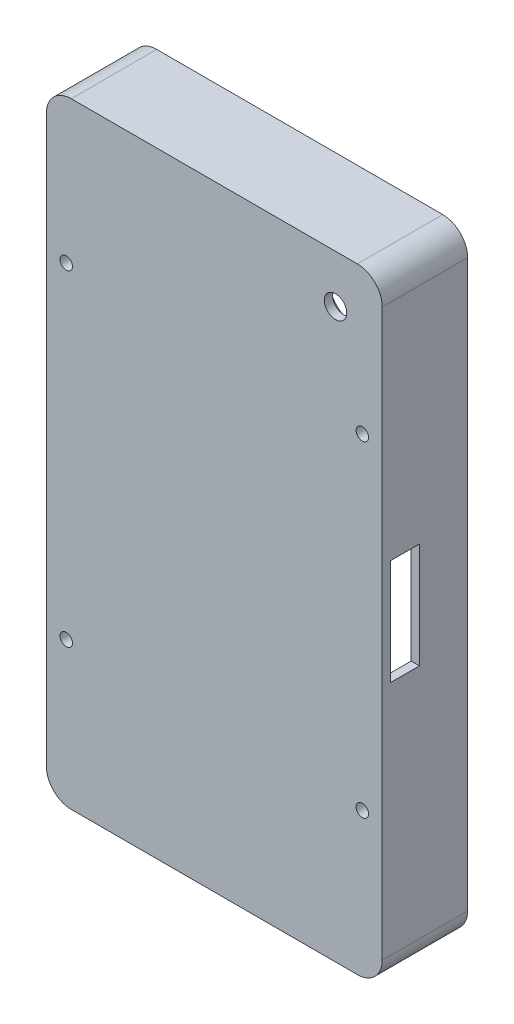
ISO-10303-21;
HEADER;
FILE_DESCRIPTION(('STEP AP214'),'2;1');
FILE_NAME('part.step','',(''),(''),'','','');
FILE_SCHEMA(('AUTOMOTIVE_DESIGN { 1 0 10303 214 1 1 1 1 }'));
ENDSEC;
DATA;
#1=APPLICATION_CONTEXT('core data for automotive mechanical design processes');
#2=APPLICATION_PROTOCOL_DEFINITION('international standard','automotive_design',2000,#1);
#3=PRODUCT_CONTEXT('',#1,'mechanical');
#4=PRODUCT('Part','Part','',(#3));
#5=PRODUCT_RELATED_PRODUCT_CATEGORY('part','',(#4));
#6=PRODUCT_DEFINITION_FORMATION('','',#4);
#7=PRODUCT_DEFINITION_CONTEXT('part definition',#1,'design');
#8=PRODUCT_DEFINITION('design','',#6,#7);
#9=PRODUCT_DEFINITION_SHAPE('','',#8);
#10=(LENGTH_UNIT() NAMED_UNIT(*) SI_UNIT(.MILLI.,.METRE.));
#11=(NAMED_UNIT(*) PLANE_ANGLE_UNIT() SI_UNIT($,.RADIAN.));
#12=(NAMED_UNIT(*) SI_UNIT($,.STERADIAN.) SOLID_ANGLE_UNIT());
#13=UNCERTAINTY_MEASURE_WITH_UNIT(LENGTH_MEASURE(1.E-05),#10,'distance_accuracy_value','');
#14=(GEOMETRIC_REPRESENTATION_CONTEXT(3) GLOBAL_UNCERTAINTY_ASSIGNED_CONTEXT((#13)) GLOBAL_UNIT_ASSIGNED_CONTEXT((#10,
#11,#12)) REPRESENTATION_CONTEXT('',''));
#15=CARTESIAN_POINT('',(0.,0.,0.));
#16=DIRECTION('',(0.,0.,1.));
#17=DIRECTION('',(1.,0.,0.));
#18=AXIS2_PLACEMENT_3D('',#15,#16,#17);
#19=CARTESIAN_POINT('',(0.,0.,0.));
#20=DIRECTION('',(0.,0.,-1.));
#21=DIRECTION('',(-1.,0.,0.));
#22=AXIS2_PLACEMENT_3D('',#19,#20,#21);
#23=PLANE('',#22);
#24=DIRECTION('',(0.,-1.,0.));
#25=VECTOR('',#24,1.);
#26=CARTESIAN_POINT('',(-40.5,-74.22,0.));
#27=LINE('',#26,#25);
#28=CARTESIAN_POINT('',(-40.5,68.22,0.));
#29=VERTEX_POINT('',#28);
#30=CARTESIAN_POINT('',(-40.5,-68.22,0.));
#31=VERTEX_POINT('',#30);
#32=EDGE_CURVE('E349',#29,#31,#27,.T.);
#33=ORIENTED_EDGE('',*,*,#32,.F.);
#34=CARTESIAN_POINT('',(-34.5,68.22,0.));
#35=DIRECTION('',(0.,0.,-1.));
#36=DIRECTION('',(-1.,0.,0.));
#37=AXIS2_PLACEMENT_3D('',#34,#35,#36);
#38=CIRCLE('',#37,6.);
#39=CARTESIAN_POINT('',(-34.5,74.22,0.));
#40=VERTEX_POINT('',#39);
#41=EDGE_CURVE('E368',#29,#40,#38,.T.);
#42=ORIENTED_EDGE('',*,*,#41,.T.);
#43=DIRECTION('',(-1.,0.,0.));
#44=VECTOR('',#43,1.);
#45=CARTESIAN_POINT('',(40.5,74.22,0.));
#46=LINE('',#45,#44);
#47=CARTESIAN_POINT('',(34.5,74.22,0.));
#48=VERTEX_POINT('',#47);
#49=EDGE_CURVE('E315',#48,#40,#46,.T.);
#50=ORIENTED_EDGE('',*,*,#49,.F.);
#51=CARTESIAN_POINT('',(34.5,68.22,0.));
#52=DIRECTION('',(0.,0.,-1.));
#53=DIRECTION('',(-1.,0.,0.));
#54=AXIS2_PLACEMENT_3D('',#51,#52,#53);
#55=CIRCLE('',#54,6.);
#56=CARTESIAN_POINT('',(40.5,68.22,0.));
#57=VERTEX_POINT('',#56);
#58=EDGE_CURVE('E366',#48,#57,#55,.T.);
#59=ORIENTED_EDGE('',*,*,#58,.T.);
#60=DIRECTION('',(0.,1.,0.));
#61=VECTOR('',#60,1.);
#62=CARTESIAN_POINT('',(40.5,-74.22,0.));
#63=LINE('',#62,#61);
#64=CARTESIAN_POINT('',(40.5,-68.22,0.));
#65=VERTEX_POINT('',#64);
#66=EDGE_CURVE('E340',#65,#57,#63,.T.);
#67=ORIENTED_EDGE('',*,*,#66,.F.);
#68=CARTESIAN_POINT('',(34.5,-68.22,0.));
#69=DIRECTION('',(0.,0.,-1.));
#70=DIRECTION('',(-1.,0.,0.));
#71=AXIS2_PLACEMENT_3D('',#68,#69,#70);
#72=CIRCLE('',#71,6.);
#73=CARTESIAN_POINT('',(34.5,-74.22,0.));
#74=VERTEX_POINT('',#73);
#75=EDGE_CURVE('E363',#65,#74,#72,.T.);
#76=ORIENTED_EDGE('',*,*,#75,.T.);
#77=DIRECTION('',(1.,0.,0.));
#78=VECTOR('',#77,1.);
#79=CARTESIAN_POINT('',(40.5,-74.22,0.));
#80=LINE('',#79,#78);
#81=CARTESIAN_POINT('',(-34.5,-74.22,0.));
#82=VERTEX_POINT('',#81);
#83=EDGE_CURVE('E352',#82,#74,#80,.T.);
#84=ORIENTED_EDGE('',*,*,#83,.F.);
#85=CARTESIAN_POINT('',(-34.5,-68.22,0.));
#86=DIRECTION('',(0.,0.,-1.));
#87=DIRECTION('',(-1.,0.,0.));
#88=AXIS2_PLACEMENT_3D('',#85,#86,#87);
#89=CIRCLE('',#88,6.);
#90=EDGE_CURVE('E361',#82,#31,#89,.T.);
#91=ORIENTED_EDGE('',*,*,#90,.T.);
#92=EDGE_LOOP('',(#33,#42,#50,#59,#67,#76,#84,#91));
#93=FACE_BOUND('',#92,.T.);
#94=CARTESIAN_POINT('',(-34.5,68.22,0.));
#95=DIRECTION('',(0.,0.,-1.));
#96=DIRECTION('',(-1.,0.,0.));
#97=AXIS2_PLACEMENT_3D('',#94,#95,#96);
#98=CIRCLE('',#97,4.);
#99=CARTESIAN_POINT('',(-38.5,68.22,0.));
#100=VERTEX_POINT('',#99);
#101=CARTESIAN_POINT('',(-34.5,72.22,0.));
#102=VERTEX_POINT('',#101);
#103=EDGE_CURVE('E284',#100,#102,#98,.T.);
#104=ORIENTED_EDGE('',*,*,#103,.F.);
#105=DIRECTION('',(0.,-1.,0.));
#106=VECTOR('',#105,1.);
#107=CARTESIAN_POINT('',(-38.5,0.,0.));
#108=LINE('',#107,#106);
#109=CARTESIAN_POINT('',(-38.5,-68.22,0.));
#110=VERTEX_POINT('',#109);
#111=EDGE_CURVE('E317',#100,#110,#108,.T.);
#112=ORIENTED_EDGE('',*,*,#111,.T.);
#113=CARTESIAN_POINT('',(-34.5,-68.22,0.));
#114=DIRECTION('',(0.,0.,-1.));
#115=DIRECTION('',(-1.,0.,0.));
#116=AXIS2_PLACEMENT_3D('',#113,#114,#115);
#117=CIRCLE('',#116,4.);
#118=CARTESIAN_POINT('',(-34.5,-72.22,0.));
#119=VERTEX_POINT('',#118);
#120=EDGE_CURVE('E303',#119,#110,#117,.T.);
#121=ORIENTED_EDGE('',*,*,#120,.F.);
#122=DIRECTION('',(1.,0.,0.));
#123=VECTOR('',#122,1.);
#124=CARTESIAN_POINT('',(0.,-72.22,0.));
#125=LINE('',#124,#123);
#126=CARTESIAN_POINT('',(34.5,-72.22,0.));
#127=VERTEX_POINT('',#126);
#128=EDGE_CURVE('E322',#119,#127,#125,.T.);
#129=ORIENTED_EDGE('',*,*,#128,.T.);
#130=CARTESIAN_POINT('',(34.5,-68.22,0.));
#131=DIRECTION('',(0.,0.,-1.));
#132=DIRECTION('',(-1.,0.,0.));
#133=AXIS2_PLACEMENT_3D('',#130,#131,#132);
#134=CIRCLE('',#133,4.);
#135=CARTESIAN_POINT('',(38.5,-68.22,0.));
#136=VERTEX_POINT('',#135);
#137=EDGE_CURVE('E325',#136,#127,#134,.T.);
#138=ORIENTED_EDGE('',*,*,#137,.F.);
#139=DIRECTION('',(0.,1.,0.));
#140=VECTOR('',#139,1.);
#141=CARTESIAN_POINT('',(38.5,0.,0.));
#142=LINE('',#141,#140);
#143=CARTESIAN_POINT('',(38.5,68.2199999999999,0.));
#144=VERTEX_POINT('',#143);
#145=EDGE_CURVE('E282',#136,#144,#142,.T.);
#146=ORIENTED_EDGE('',*,*,#145,.T.);
#147=CARTESIAN_POINT('',(34.5,68.22,0.));
#148=DIRECTION('',(0.,0.,-1.));
#149=DIRECTION('',(-1.,0.,0.));
#150=AXIS2_PLACEMENT_3D('',#147,#148,#149);
#151=CIRCLE('',#150,4.);
#152=CARTESIAN_POINT('',(34.5,72.22,0.));
#153=VERTEX_POINT('',#152);
#154=EDGE_CURVE('E319',#153,#144,#151,.T.);
#155=ORIENTED_EDGE('',*,*,#154,.F.);
#156=DIRECTION('',(-1.,0.,0.));
#157=VECTOR('',#156,1.);
#158=CARTESIAN_POINT('',(0.,72.22,0.));
#159=LINE('',#158,#157);
#160=EDGE_CURVE('E275',#153,#102,#159,.T.);
#161=ORIENTED_EDGE('',*,*,#160,.T.);
#162=EDGE_LOOP('',(#104,#112,#121,#129,#138,#146,#155,#161));
#163=FACE_BOUND('',#162,.T.);
#164=ADVANCED_FACE('F44',(#93,#163),#23,.T.);
#165=CARTESIAN_POINT('',(40.5,74.22,20.6));
#166=DIRECTION('',(0.,-1.,0.));
#167=DIRECTION('',(0.,0.,-1.));
#168=AXIS2_PLACEMENT_3D('',#165,#166,#167);
#169=PLANE('',#168);
#170=ORIENTED_EDGE('',*,*,#49,.T.);
#171=DIRECTION('',(0.,0.,-1.));
#172=VECTOR('',#171,1.);
#173=CARTESIAN_POINT('',(-34.5,74.22,20.6));
#174=LINE('',#173,#172);
#175=CARTESIAN_POINT('',(-34.5,74.22,20.6));
#176=VERTEX_POINT('',#175);
#177=EDGE_CURVE('E371',#40,#176,#174,.F.);
#178=ORIENTED_EDGE('',*,*,#177,.T.);
#179=DIRECTION('',(-1.,0.,0.));
#180=VECTOR('',#179,1.);
#181=CARTESIAN_POINT('',(40.5,74.22,20.6));
#182=LINE('',#181,#180);
#183=CARTESIAN_POINT('',(34.5,74.22,20.6));
#184=VERTEX_POINT('',#183);
#185=EDGE_CURVE('E331',#184,#176,#182,.T.);
#186=ORIENTED_EDGE('',*,*,#185,.F.);
#187=DIRECTION('',(0.,0.,-1.));
#188=VECTOR('',#187,1.);
#189=CARTESIAN_POINT('',(34.5,74.22,20.6));
#190=LINE('',#189,#188);
#191=EDGE_CURVE('E369',#184,#48,#190,.T.);
#192=ORIENTED_EDGE('',*,*,#191,.T.);
#193=EDGE_LOOP('',(#170,#178,#186,#192));
#194=FACE_BOUND('',#193,.T.);
#195=ADVANCED_FACE('F457',(#194),#169,.F.);
#196=CARTESIAN_POINT('',(-40.5,-74.22,20.6));
#197=DIRECTION('',(1.,0.,0.));
#198=DIRECTION('',(0.,0.,-1.));
#199=AXIS2_PLACEMENT_3D('',#196,#197,#198);
#200=PLANE('',#199);
#201=DIRECTION('',(0.,-1.,0.));
#202=VECTOR('',#201,1.);
#203=CARTESIAN_POINT('',(-40.5,-74.22,20.6));
#204=LINE('',#203,#202);
#205=CARTESIAN_POINT('',(-40.5,68.22,20.6));
#206=VERTEX_POINT('',#205);
#207=CARTESIAN_POINT('',(-40.5,-68.22,20.6));
#208=VERTEX_POINT('',#207);
#209=EDGE_CURVE('E338',#206,#208,#204,.T.);
#210=ORIENTED_EDGE('',*,*,#209,.F.);
#211=DIRECTION('',(0.,0.,-1.));
#212=VECTOR('',#211,1.);
#213=CARTESIAN_POINT('',(-40.5,68.22,20.6));
#214=LINE('',#213,#212);
#215=EDGE_CURVE('E356',#206,#29,#214,.T.);
#216=ORIENTED_EDGE('',*,*,#215,.T.);
#217=ORIENTED_EDGE('',*,*,#32,.T.);
#218=DIRECTION('',(0.,0.,-1.));
#219=VECTOR('',#218,1.);
#220=CARTESIAN_POINT('',(-40.5,-68.22,20.6));
#221=LINE('',#220,#219);
#222=EDGE_CURVE('E350',#31,#208,#221,.F.);
#223=ORIENTED_EDGE('',*,*,#222,.T.);
#224=EDGE_LOOP('',(#210,#216,#217,#223));
#225=FACE_BOUND('',#224,.T.);
#226=ADVANCED_FACE('F463',(#225),#200,.F.);
#227=CARTESIAN_POINT('',(40.5,-74.22,20.6));
#228=DIRECTION('',(0.,1.,0.));
#229=DIRECTION('',(0.,0.,1.));
#230=AXIS2_PLACEMENT_3D('',#227,#228,#229);
#231=PLANE('',#230);
#232=ORIENTED_EDGE('',*,*,#83,.T.);
#233=DIRECTION('',(0.,0.,-1.));
#234=VECTOR('',#233,1.);
#235=CARTESIAN_POINT('',(34.5,-74.22,20.6));
#236=LINE('',#235,#234);
#237=CARTESIAN_POINT('',(34.5,-74.22,20.6));
#238=VERTEX_POINT('',#237);
#239=EDGE_CURVE('E391',#74,#238,#236,.F.);
#240=ORIENTED_EDGE('',*,*,#239,.T.);
#241=DIRECTION('',(1.,0.,0.));
#242=VECTOR('',#241,1.);
#243=CARTESIAN_POINT('',(40.5,-74.22,20.6));
#244=LINE('',#243,#242);
#245=CARTESIAN_POINT('',(-34.5,-74.22,20.6));
#246=VERTEX_POINT('',#245);
#247=EDGE_CURVE('E337',#246,#238,#244,.T.);
#248=ORIENTED_EDGE('',*,*,#247,.F.);
#249=DIRECTION('',(0.,0.,-1.));
#250=VECTOR('',#249,1.);
#251=CARTESIAN_POINT('',(-34.5,-74.22,20.6));
#252=LINE('',#251,#250);
#253=EDGE_CURVE('E390',#246,#82,#252,.T.);
#254=ORIENTED_EDGE('',*,*,#253,.T.);
#255=EDGE_LOOP('',(#232,#240,#248,#254));
#256=FACE_BOUND('',#255,.T.);
#257=ADVANCED_FACE('F474',(#256),#231,.F.);
#258=CARTESIAN_POINT('',(40.5,-74.22,20.6));
#259=DIRECTION('',(-1.,0.,0.));
#260=DIRECTION('',(0.,0.,1.));
#261=AXIS2_PLACEMENT_3D('',#258,#259,#260);
#262=PLANE('',#261);
#263=DIRECTION('',(0.,1.,0.));
#264=VECTOR('',#263,1.);
#265=CARTESIAN_POINT('',(40.5,-11.22,11.6209129616574));
#266=LINE('',#265,#264);
#267=CARTESIAN_POINT('',(40.5,-11.22,11.6209129616574));
#268=VERTEX_POINT('',#267);
#269=CARTESIAN_POINT('',(40.5,14.2245881606241,11.6209129616574));
#270=VERTEX_POINT('',#269);
#271=EDGE_CURVE('E191',#268,#270,#266,.T.);
#272=ORIENTED_EDGE('',*,*,#271,.F.);
#273=DIRECTION('',(0.,0.,-1.));
#274=VECTOR('',#273,1.);
#275=CARTESIAN_POINT('',(40.5,-11.22,11.6209129616574));
#276=LINE('',#275,#274);
#277=CARTESIAN_POINT('',(40.5,-11.22,18.6));
#278=VERTEX_POINT('',#277);
#279=EDGE_CURVE('E58',#278,#268,#276,.T.);
#280=ORIENTED_EDGE('',*,*,#279,.F.);
#281=DIRECTION('',(0.,-1.,0.));
#282=VECTOR('',#281,1.);
#283=CARTESIAN_POINT('',(40.5,-11.22,18.6));
#284=LINE('',#283,#282);
#285=CARTESIAN_POINT('',(40.5,14.2245881606241,18.6));
#286=VERTEX_POINT('',#285);
#287=EDGE_CURVE('E198',#286,#278,#284,.T.);
#288=ORIENTED_EDGE('',*,*,#287,.F.);
#289=DIRECTION('',(0.,0.,1.));
#290=VECTOR('',#289,1.);
#291=CARTESIAN_POINT('',(40.5,14.2245881606241,11.6209129616574));
#292=LINE('',#291,#290);
#293=EDGE_CURVE('E181',#270,#286,#292,.T.);
#294=ORIENTED_EDGE('',*,*,#293,.F.);
#295=EDGE_LOOP('',(#272,#280,#288,#294));
#296=FACE_BOUND('',#295,.T.);
#297=ORIENTED_EDGE('',*,*,#66,.T.);
#298=DIRECTION('',(0.,0.,-1.));
#299=VECTOR('',#298,1.);
#300=CARTESIAN_POINT('',(40.5,68.22,20.6));
#301=LINE('',#300,#299);
#302=CARTESIAN_POINT('',(40.5,68.22,20.6));
#303=VERTEX_POINT('',#302);
#304=EDGE_CURVE('E389',#57,#303,#301,.F.);
#305=ORIENTED_EDGE('',*,*,#304,.T.);
#306=DIRECTION('',(0.,1.,0.));
#307=VECTOR('',#306,1.);
#308=CARTESIAN_POINT('',(40.5,-74.22,20.6));
#309=LINE('',#308,#307);
#310=CARTESIAN_POINT('',(40.5,-68.22,20.6));
#311=VERTEX_POINT('',#310);
#312=EDGE_CURVE('E343',#311,#303,#309,.T.);
#313=ORIENTED_EDGE('',*,*,#312,.F.);
#314=DIRECTION('',(0.,0.,-1.));
#315=VECTOR('',#314,1.);
#316=CARTESIAN_POINT('',(40.5,-68.22,20.6));
#317=LINE('',#316,#315);
#318=EDGE_CURVE('E381',#311,#65,#317,.T.);
#319=ORIENTED_EDGE('',*,*,#318,.T.);
#320=EDGE_LOOP('',(#297,#305,#313,#319));
#321=FACE_BOUND('',#320,.T.);
#322=ADVANCED_FACE('F194',(#296,#321),#262,.F.);
#323=CARTESIAN_POINT('',(0.,0.,20.6));
#324=DIRECTION('',(0.,0.,-1.));
#325=DIRECTION('',(-1.,0.,0.));
#326=AXIS2_PLACEMENT_3D('',#323,#324,#325);
#327=PLANE('',#326);
#328=CARTESIAN_POINT('',(-35.7,39.32,20.6));
#329=DIRECTION('',(0.,0.,-1.));
#330=DIRECTION('',(1.,0.,0.));
#331=AXIS2_PLACEMENT_3D('',#328,#329,#330);
#332=CIRCLE('',#331,1.5);
#333=CARTESIAN_POINT('',(-34.2,39.32,20.6));
#334=VERTEX_POINT('',#333);
#335=EDGE_CURVE('E204',#334,#334,#332,.T.);
#336=ORIENTED_EDGE('',*,*,#335,.T.);
#337=EDGE_LOOP('',(#336));
#338=FACE_BOUND('',#337,.T.);
#339=CARTESIAN_POINT('',(35.7,39.32,20.6));
#340=DIRECTION('',(0.,0.,-1.));
#341=DIRECTION('',(-1.,0.,0.));
#342=AXIS2_PLACEMENT_3D('',#339,#340,#341);
#343=CIRCLE('',#342,1.5);
#344=CARTESIAN_POINT('',(34.2,39.32,20.6));
#345=VERTEX_POINT('',#344);
#346=EDGE_CURVE('E215',#345,#345,#343,.T.);
#347=ORIENTED_EDGE('',*,*,#346,.T.);
#348=EDGE_LOOP('',(#347));
#349=FACE_BOUND('',#348,.T.);
#350=CARTESIAN_POINT('',(35.7,-39.32,20.6));
#351=DIRECTION('',(0.,0.,-1.));
#352=DIRECTION('',(1.,0.,0.));
#353=AXIS2_PLACEMENT_3D('',#350,#351,#352);
#354=CIRCLE('',#353,1.5);
#355=CARTESIAN_POINT('',(37.2,-39.32,20.6));
#356=VERTEX_POINT('',#355);
#357=EDGE_CURVE('E209',#356,#356,#354,.T.);
#358=ORIENTED_EDGE('',*,*,#357,.T.);
#359=EDGE_LOOP('',(#358));
#360=FACE_BOUND('',#359,.T.);
#361=CARTESIAN_POINT('',(-35.7,-39.32,20.6));
#362=DIRECTION('',(0.,0.,-1.));
#363=DIRECTION('',(-1.,0.,0.));
#364=AXIS2_PLACEMENT_3D('',#361,#362,#363);
#365=CIRCLE('',#364,1.5);
#366=CARTESIAN_POINT('',(-37.2,-39.32,20.6));
#367=VERTEX_POINT('',#366);
#368=EDGE_CURVE('E211',#367,#367,#365,.T.);
#369=ORIENTED_EDGE('',*,*,#368,.T.);
#370=EDGE_LOOP('',(#369));
#371=FACE_BOUND('',#370,.T.);
#372=CARTESIAN_POINT('',(29.2437098660317,62.6507392450305,20.6));
#373=DIRECTION('',(0.,0.,-1.));
#374=DIRECTION('',(-1.,0.,0.));
#375=AXIS2_PLACEMENT_3D('',#372,#373,#374);
#376=CIRCLE('',#375,2.69844628727688);
#377=CARTESIAN_POINT('',(26.5452635787548,62.6507392450305,20.6));
#378=VERTEX_POINT('',#377);
#379=EDGE_CURVE('E223',#378,#378,#376,.T.);
#380=ORIENTED_EDGE('',*,*,#379,.T.);
#381=EDGE_LOOP('',(#380));
#382=FACE_BOUND('',#381,.T.);
#383=ORIENTED_EDGE('',*,*,#185,.T.);
#384=CARTESIAN_POINT('',(-34.5,68.22,20.6));
#385=DIRECTION('',(0.,0.,-1.));
#386=DIRECTION('',(-1.,0.,0.));
#387=AXIS2_PLACEMENT_3D('',#384,#385,#386);
#388=CIRCLE('',#387,6.);
#389=EDGE_CURVE('E382',#176,#206,#388,.F.);
#390=ORIENTED_EDGE('',*,*,#389,.T.);
#391=ORIENTED_EDGE('',*,*,#209,.T.);
#392=CARTESIAN_POINT('',(-34.5,-68.22,20.6));
#393=DIRECTION('',(0.,0.,-1.));
#394=DIRECTION('',(-1.,0.,0.));
#395=AXIS2_PLACEMENT_3D('',#392,#393,#394);
#396=CIRCLE('',#395,6.);
#397=EDGE_CURVE('E372',#208,#246,#396,.F.);
#398=ORIENTED_EDGE('',*,*,#397,.T.);
#399=ORIENTED_EDGE('',*,*,#247,.T.);
#400=CARTESIAN_POINT('',(34.5,-68.22,20.6));
#401=DIRECTION('',(0.,0.,-1.));
#402=DIRECTION('',(-1.,0.,0.));
#403=AXIS2_PLACEMENT_3D('',#400,#401,#402);
#404=CIRCLE('',#403,6.);
#405=EDGE_CURVE('E380',#238,#311,#404,.F.);
#406=ORIENTED_EDGE('',*,*,#405,.T.);
#407=ORIENTED_EDGE('',*,*,#312,.T.);
#408=CARTESIAN_POINT('',(34.5,68.22,20.6));
#409=DIRECTION('',(0.,0.,-1.));
#410=DIRECTION('',(-1.,0.,0.));
#411=AXIS2_PLACEMENT_3D('',#408,#409,#410);
#412=CIRCLE('',#411,6.);
#413=EDGE_CURVE('E376',#303,#184,#412,.F.);
#414=ORIENTED_EDGE('',*,*,#413,.T.);
#415=EDGE_LOOP('',(#383,#390,#391,#398,#399,#406,#407,#414));
#416=FACE_BOUND('',#415,.T.);
#417=ADVANCED_FACE('F469',(#338,#349,#360,#371,#382,#416),#327,.F.);
#418=CARTESIAN_POINT('',(-34.5,68.22,20.6));
#419=DIRECTION('',(0.,0.,-1.));
#420=DIRECTION('',(-1.,0.,0.));
#421=AXIS2_PLACEMENT_3D('',#418,#419,#420);
#422=CYLINDRICAL_SURFACE('',#421,6.);
#423=ORIENTED_EDGE('',*,*,#389,.F.);
#424=ORIENTED_EDGE('',*,*,#177,.F.);
#425=ORIENTED_EDGE('',*,*,#41,.F.);
#426=ORIENTED_EDGE('',*,*,#215,.F.);
#427=EDGE_LOOP('',(#423,#424,#425,#426));
#428=FACE_BOUND('',#427,.T.);
#429=ADVANCED_FACE('F483',(#428),#422,.T.);
#430=CARTESIAN_POINT('',(34.5,68.22,20.6));
#431=DIRECTION('',(0.,0.,-1.));
#432=DIRECTION('',(-1.,0.,0.));
#433=AXIS2_PLACEMENT_3D('',#430,#431,#432);
#434=CYLINDRICAL_SURFACE('',#433,6.);
#435=ORIENTED_EDGE('',*,*,#413,.F.);
#436=ORIENTED_EDGE('',*,*,#304,.F.);
#437=ORIENTED_EDGE('',*,*,#58,.F.);
#438=ORIENTED_EDGE('',*,*,#191,.F.);
#439=EDGE_LOOP('',(#435,#436,#437,#438));
#440=FACE_BOUND('',#439,.T.);
#441=ADVANCED_FACE('F485',(#440),#434,.T.);
#442=CARTESIAN_POINT('',(34.5,-68.22,20.6));
#443=DIRECTION('',(0.,0.,-1.));
#444=DIRECTION('',(-1.,0.,0.));
#445=AXIS2_PLACEMENT_3D('',#442,#443,#444);
#446=CYLINDRICAL_SURFACE('',#445,6.);
#447=ORIENTED_EDGE('',*,*,#405,.F.);
#448=ORIENTED_EDGE('',*,*,#239,.F.);
#449=ORIENTED_EDGE('',*,*,#75,.F.);
#450=ORIENTED_EDGE('',*,*,#318,.F.);
#451=EDGE_LOOP('',(#447,#448,#449,#450));
#452=FACE_BOUND('',#451,.T.);
#453=ADVANCED_FACE('F490',(#452),#446,.T.);
#454=CARTESIAN_POINT('',(-34.5,-68.22,20.6));
#455=DIRECTION('',(0.,0.,-1.));
#456=DIRECTION('',(-1.,0.,0.));
#457=AXIS2_PLACEMENT_3D('',#454,#455,#456);
#458=CYLINDRICAL_SURFACE('',#457,6.);
#459=ORIENTED_EDGE('',*,*,#397,.F.);
#460=ORIENTED_EDGE('',*,*,#222,.F.);
#461=ORIENTED_EDGE('',*,*,#90,.F.);
#462=ORIENTED_EDGE('',*,*,#253,.F.);
#463=EDGE_LOOP('',(#459,#460,#461,#462));
#464=FACE_BOUND('',#463,.T.);
#465=ADVANCED_FACE('F50',(#464),#458,.T.);
#466=CARTESIAN_POINT('',(40.5,72.22,20.6));
#467=DIRECTION('',(0.,-1.,0.));
#468=DIRECTION('',(0.,0.,-1.));
#469=AXIS2_PLACEMENT_3D('',#466,#467,#468);
#470=PLANE('',#469);
#471=ORIENTED_EDGE('',*,*,#160,.F.);
#472=DIRECTION('',(0.,0.,-1.));
#473=VECTOR('',#472,1.);
#474=CARTESIAN_POINT('',(34.5,72.22,20.6));
#475=LINE('',#474,#473);
#476=CARTESIAN_POINT('',(34.5,72.22,18.6));
#477=VERTEX_POINT('',#476);
#478=EDGE_CURVE('E276',#477,#153,#475,.T.);
#479=ORIENTED_EDGE('',*,*,#478,.F.);
#480=DIRECTION('',(-1.,0.,0.));
#481=VECTOR('',#480,1.);
#482=CARTESIAN_POINT('',(0.,72.22,18.6));
#483=LINE('',#482,#481);
#484=CARTESIAN_POINT('',(-34.5,72.22,18.6));
#485=VERTEX_POINT('',#484);
#486=EDGE_CURVE('E280',#477,#485,#483,.T.);
#487=ORIENTED_EDGE('',*,*,#486,.T.);
#488=DIRECTION('',(0.,0.,-1.));
#489=VECTOR('',#488,1.);
#490=CARTESIAN_POINT('',(-34.5,72.22,20.6));
#491=LINE('',#490,#489);
#492=EDGE_CURVE('E273',#102,#485,#491,.F.);
#493=ORIENTED_EDGE('',*,*,#492,.F.);
#494=EDGE_LOOP('',(#471,#479,#487,#493));
#495=FACE_BOUND('',#494,.T.);
#496=ADVANCED_FACE('F422',(#495),#470,.T.);
#497=CARTESIAN_POINT('',(-38.5,-74.22,20.6));
#498=DIRECTION('',(1.,0.,0.));
#499=DIRECTION('',(0.,0.,-1.));
#500=AXIS2_PLACEMENT_3D('',#497,#498,#499);
#501=PLANE('',#500);
#502=DIRECTION('',(0.,-1.,0.));
#503=VECTOR('',#502,1.);
#504=CARTESIAN_POINT('',(-38.5,0.,18.6));
#505=LINE('',#504,#503);
#506=CARTESIAN_POINT('',(-38.5,68.2199999999999,18.6));
#507=VERTEX_POINT('',#506);
#508=CARTESIAN_POINT('',(-38.5,-68.22,18.6));
#509=VERTEX_POINT('',#508);
#510=EDGE_CURVE('E279',#507,#509,#505,.T.);
#511=ORIENTED_EDGE('',*,*,#510,.T.);
#512=DIRECTION('',(0.,0.,-1.));
#513=VECTOR('',#512,1.);
#514=CARTESIAN_POINT('',(-38.5,-68.22,20.6));
#515=LINE('',#514,#513);
#516=EDGE_CURVE('E302',#110,#509,#515,.F.);
#517=ORIENTED_EDGE('',*,*,#516,.F.);
#518=ORIENTED_EDGE('',*,*,#111,.F.);
#519=DIRECTION('',(0.,0.,-1.));
#520=VECTOR('',#519,1.);
#521=CARTESIAN_POINT('',(-38.5,68.2199999999999,20.6));
#522=LINE('',#521,#520);
#523=EDGE_CURVE('E304',#507,#100,#522,.T.);
#524=ORIENTED_EDGE('',*,*,#523,.F.);
#525=EDGE_LOOP('',(#511,#517,#518,#524));
#526=FACE_BOUND('',#525,.T.);
#527=ADVANCED_FACE('F445',(#526),#501,.T.);
#528=CARTESIAN_POINT('',(40.5,-72.22,20.6));
#529=DIRECTION('',(0.,1.,0.));
#530=DIRECTION('',(0.,0.,1.));
#531=AXIS2_PLACEMENT_3D('',#528,#529,#530);
#532=PLANE('',#531);
#533=ORIENTED_EDGE('',*,*,#128,.F.);
#534=DIRECTION('',(0.,0.,1.));
#535=VECTOR('',#534,1.);
#536=CARTESIAN_POINT('',(-34.5,-72.22,20.6));
#537=LINE('',#536,#535);
#538=CARTESIAN_POINT('',(-34.5,-72.22,18.6));
#539=VERTEX_POINT('',#538);
#540=EDGE_CURVE('E310',#539,#119,#537,.F.);
#541=ORIENTED_EDGE('',*,*,#540,.F.);
#542=DIRECTION('',(1.,0.,0.));
#543=VECTOR('',#542,1.);
#544=CARTESIAN_POINT('',(0.,-72.22,18.6));
#545=LINE('',#544,#543);
#546=CARTESIAN_POINT('',(34.5,-72.22,18.6));
#547=VERTEX_POINT('',#546);
#548=EDGE_CURVE('E287',#539,#547,#545,.T.);
#549=ORIENTED_EDGE('',*,*,#548,.T.);
#550=DIRECTION('',(0.,0.,1.));
#551=VECTOR('',#550,1.);
#552=CARTESIAN_POINT('',(34.5,-72.22,20.6));
#553=LINE('',#552,#551);
#554=EDGE_CURVE('E308',#127,#547,#553,.T.);
#555=ORIENTED_EDGE('',*,*,#554,.F.);
#556=EDGE_LOOP('',(#533,#541,#549,#555));
#557=FACE_BOUND('',#556,.T.);
#558=ADVANCED_FACE('F434',(#557),#532,.T.);
#559=CARTESIAN_POINT('',(38.5,-74.22,20.6));
#560=DIRECTION('',(-1.,0.,0.));
#561=DIRECTION('',(0.,0.,1.));
#562=AXIS2_PLACEMENT_3D('',#559,#560,#561);
#563=PLANE('',#562);
#564=DIRECTION('',(0.,0.,1.));
#565=VECTOR('',#564,1.);
#566=CARTESIAN_POINT('',(38.5,-11.22,20.6));
#567=LINE('',#566,#565);
#568=CARTESIAN_POINT('',(38.5,-11.22,11.6209129616574));
#569=VERTEX_POINT('',#568);
#570=CARTESIAN_POINT('',(38.5,-11.22,18.6));
#571=VERTEX_POINT('',#570);
#572=EDGE_CURVE('E11',#569,#571,#567,.T.);
#573=ORIENTED_EDGE('',*,*,#572,.F.);
#574=DIRECTION('',(0.,-1.,0.));
#575=VECTOR('',#574,1.);
#576=CARTESIAN_POINT('',(38.5,-74.22,11.6209129616574));
#577=LINE('',#576,#575);
#578=CARTESIAN_POINT('',(38.5,14.2245881606241,11.6209129616574));
#579=VERTEX_POINT('',#578);
#580=EDGE_CURVE('E398',#579,#569,#577,.T.);
#581=ORIENTED_EDGE('',*,*,#580,.F.);
#582=DIRECTION('',(0.,0.,-1.));
#583=VECTOR('',#582,1.);
#584=CARTESIAN_POINT('',(38.5,14.2245881606241,20.6));
#585=LINE('',#584,#583);
#586=CARTESIAN_POINT('',(38.5,14.2245881606241,18.6));
#587=VERTEX_POINT('',#586);
#588=EDGE_CURVE('E52',#587,#579,#585,.T.);
#589=ORIENTED_EDGE('',*,*,#588,.F.);
#590=DIRECTION('',(0.,1.,0.));
#591=VECTOR('',#590,1.);
#592=CARTESIAN_POINT('',(38.5,0.,18.6));
#593=LINE('',#592,#591);
#594=CARTESIAN_POINT('',(38.5,68.2199999999999,18.6));
#595=VERTEX_POINT('',#594);
#596=EDGE_CURVE('E294',#587,#595,#593,.T.);
#597=ORIENTED_EDGE('',*,*,#596,.T.);
#598=DIRECTION('',(0.,0.,1.));
#599=VECTOR('',#598,1.);
#600=CARTESIAN_POINT('',(38.5,68.2199999999999,20.6));
#601=LINE('',#600,#599);
#602=EDGE_CURVE('E314',#144,#595,#601,.T.);
#603=ORIENTED_EDGE('',*,*,#602,.F.);
#604=ORIENTED_EDGE('',*,*,#145,.F.);
#605=DIRECTION('',(0.,0.,1.));
#606=VECTOR('',#605,1.);
#607=CARTESIAN_POINT('',(38.5,-68.22,20.6));
#608=LINE('',#607,#606);
#609=CARTESIAN_POINT('',(38.5,-68.22,18.6));
#610=VERTEX_POINT('',#609);
#611=EDGE_CURVE('E289',#610,#136,#608,.F.);
#612=ORIENTED_EDGE('',*,*,#611,.F.);
#613=EDGE_CURVE('E300',#610,#571,#593,.T.);
#614=ORIENTED_EDGE('',*,*,#613,.T.);
#615=EDGE_LOOP('',(#573,#581,#589,#597,#603,#604,#612,#614));
#616=FACE_BOUND('',#615,.T.);
#617=ADVANCED_FACE('F402',(#616),#563,.T.);
#618=CARTESIAN_POINT('',(0.,0.,18.6));
#619=DIRECTION('',(0.,0.,-1.));
#620=DIRECTION('',(-1.,0.,0.));
#621=AXIS2_PLACEMENT_3D('',#618,#619,#620);
#622=PLANE('',#621);
#623=ORIENTED_EDGE('',*,*,#596,.F.);
#624=DIRECTION('',(1.,0.,0.));
#625=VECTOR('',#624,1.);
#626=CARTESIAN_POINT('',(33.5,14.2245881606241,18.6));
#627=LINE('',#626,#625);
#628=EDGE_CURVE('E190',#587,#286,#627,.T.);
#629=ORIENTED_EDGE('',*,*,#628,.T.);
#630=ORIENTED_EDGE('',*,*,#287,.T.);
#631=DIRECTION('',(1.,0.,0.));
#632=VECTOR('',#631,1.);
#633=CARTESIAN_POINT('',(33.5,-11.22,18.6));
#634=LINE('',#633,#632);
#635=EDGE_CURVE('E202',#571,#278,#634,.T.);
#636=ORIENTED_EDGE('',*,*,#635,.F.);
#637=ORIENTED_EDGE('',*,*,#613,.F.);
#638=CARTESIAN_POINT('',(34.5,-68.22,18.6));
#639=DIRECTION('',(0.,0.,-1.));
#640=DIRECTION('',(-1.,0.,0.));
#641=AXIS2_PLACEMENT_3D('',#638,#639,#640);
#642=CIRCLE('',#641,4.);
#643=EDGE_CURVE('E295',#547,#610,#642,.F.);
#644=ORIENTED_EDGE('',*,*,#643,.F.);
#645=ORIENTED_EDGE('',*,*,#548,.F.);
#646=CARTESIAN_POINT('',(-34.5,-68.22,18.6));
#647=DIRECTION('',(0.,0.,-1.));
#648=DIRECTION('',(-1.,0.,0.));
#649=AXIS2_PLACEMENT_3D('',#646,#647,#648);
#650=CIRCLE('',#649,4.);
#651=EDGE_CURVE('E274',#509,#539,#650,.F.);
#652=ORIENTED_EDGE('',*,*,#651,.F.);
#653=ORIENTED_EDGE('',*,*,#510,.F.);
#654=CARTESIAN_POINT('',(-34.5,68.22,18.6));
#655=DIRECTION('',(0.,0.,-1.));
#656=DIRECTION('',(-1.,0.,0.));
#657=AXIS2_PLACEMENT_3D('',#654,#655,#656);
#658=CIRCLE('',#657,4.);
#659=EDGE_CURVE('E281',#485,#507,#658,.F.);
#660=ORIENTED_EDGE('',*,*,#659,.F.);
#661=ORIENTED_EDGE('',*,*,#486,.F.);
#662=CARTESIAN_POINT('',(34.5,68.22,18.6));
#663=DIRECTION('',(0.,0.,-1.));
#664=DIRECTION('',(-1.,0.,0.));
#665=AXIS2_PLACEMENT_3D('',#662,#663,#664);
#666=CIRCLE('',#665,4.);
#667=EDGE_CURVE('E286',#595,#477,#666,.F.);
#668=ORIENTED_EDGE('',*,*,#667,.F.);
#669=EDGE_LOOP('',(#623,#629,#630,#636,#637,#644,#645,#652,#653,#660,#661,#668));
#670=FACE_BOUND('',#669,.T.);
#671=CARTESIAN_POINT('',(29.2437098660317,62.6507392450305,18.6));
#672=DIRECTION('',(0.,0.,-1.));
#673=DIRECTION('',(-1.,0.,0.));
#674=AXIS2_PLACEMENT_3D('',#671,#672,#673);
#675=CIRCLE('',#674,7.6);
#676=CARTESIAN_POINT('',(21.6437098660317,62.6507392450305,18.6));
#677=VERTEX_POINT('',#676);
#678=EDGE_CURVE('E228',#677,#677,#675,.F.);
#679=ORIENTED_EDGE('',*,*,#678,.T.);
#680=EDGE_LOOP('',(#679));
#681=FACE_BOUND('',#680,.T.);
#682=CARTESIAN_POINT('',(-35.7,39.32,18.6));
#683=DIRECTION('',(0.,0.,-1.));
#684=DIRECTION('',(-1.,0.,0.));
#685=AXIS2_PLACEMENT_3D('',#682,#683,#684);
#686=CIRCLE('',#685,2.5);
#687=CARTESIAN_POINT('',(-38.2,39.32,18.6));
#688=VERTEX_POINT('',#687);
#689=EDGE_CURVE('E238',#688,#688,#686,.F.);
#690=ORIENTED_EDGE('',*,*,#689,.T.);
#691=EDGE_LOOP('',(#690));
#692=FACE_BOUND('',#691,.T.);
#693=CARTESIAN_POINT('',(35.7,39.32,18.6));
#694=DIRECTION('',(0.,0.,-1.));
#695=DIRECTION('',(-1.,0.,0.));
#696=AXIS2_PLACEMENT_3D('',#693,#694,#695);
#697=CIRCLE('',#696,2.5);
#698=CARTESIAN_POINT('',(33.2,39.32,18.6));
#699=VERTEX_POINT('',#698);
#700=EDGE_CURVE('E246',#699,#699,#697,.F.);
#701=ORIENTED_EDGE('',*,*,#700,.T.);
#702=EDGE_LOOP('',(#701));
#703=FACE_BOUND('',#702,.T.);
#704=CARTESIAN_POINT('',(35.7,-39.32,18.6));
#705=DIRECTION('',(0.,0.,-1.));
#706=DIRECTION('',(-1.,0.,0.));
#707=AXIS2_PLACEMENT_3D('',#704,#705,#706);
#708=CIRCLE('',#707,2.5);
#709=CARTESIAN_POINT('',(33.2,-39.32,18.6));
#710=VERTEX_POINT('',#709);
#711=EDGE_CURVE('E257',#710,#710,#708,.F.);
#712=ORIENTED_EDGE('',*,*,#711,.T.);
#713=EDGE_LOOP('',(#712));
#714=FACE_BOUND('',#713,.T.);
#715=CARTESIAN_POINT('',(-35.7,-39.32,18.6));
#716=DIRECTION('',(0.,0.,-1.));
#717=DIRECTION('',(-1.,0.,0.));
#718=AXIS2_PLACEMENT_3D('',#715,#716,#717);
#719=CIRCLE('',#718,2.5);
#720=CARTESIAN_POINT('',(-38.2,-39.32,18.6));
#721=VERTEX_POINT('',#720);
#722=EDGE_CURVE('E270',#721,#721,#719,.F.);
#723=ORIENTED_EDGE('',*,*,#722,.T.);
#724=EDGE_LOOP('',(#723));
#725=FACE_BOUND('',#724,.T.);
#726=ADVANCED_FACE('F406',(#670,#681,#692,#703,#714,#725),#622,.T.);
#727=CARTESIAN_POINT('',(-34.5,68.22,20.6));
#728=DIRECTION('',(0.,0.,-1.));
#729=DIRECTION('',(-1.,0.,0.));
#730=AXIS2_PLACEMENT_3D('',#727,#728,#729);
#731=CYLINDRICAL_SURFACE('',#730,4.);
#732=ORIENTED_EDGE('',*,*,#659,.T.);
#733=ORIENTED_EDGE('',*,*,#523,.T.);
#734=ORIENTED_EDGE('',*,*,#103,.T.);
#735=ORIENTED_EDGE('',*,*,#492,.T.);
#736=EDGE_LOOP('',(#732,#733,#734,#735));
#737=FACE_BOUND('',#736,.T.);
#738=ADVANCED_FACE('F442',(#737),#731,.F.);
#739=CARTESIAN_POINT('',(34.5,68.22,20.6));
#740=DIRECTION('',(0.,0.,-1.));
#741=DIRECTION('',(-1.,0.,0.));
#742=AXIS2_PLACEMENT_3D('',#739,#740,#741);
#743=CYLINDRICAL_SURFACE('',#742,4.);
#744=ORIENTED_EDGE('',*,*,#667,.T.);
#745=ORIENTED_EDGE('',*,*,#478,.T.);
#746=ORIENTED_EDGE('',*,*,#154,.T.);
#747=ORIENTED_EDGE('',*,*,#602,.T.);
#748=EDGE_LOOP('',(#744,#745,#746,#747));
#749=FACE_BOUND('',#748,.T.);
#750=ADVANCED_FACE('F412',(#749),#743,.F.);
#751=CARTESIAN_POINT('',(34.5,-68.22,20.6));
#752=DIRECTION('',(0.,0.,-1.));
#753=DIRECTION('',(-1.,0.,0.));
#754=AXIS2_PLACEMENT_3D('',#751,#752,#753);
#755=CYLINDRICAL_SURFACE('',#754,4.);
#756=ORIENTED_EDGE('',*,*,#643,.T.);
#757=ORIENTED_EDGE('',*,*,#611,.T.);
#758=ORIENTED_EDGE('',*,*,#137,.T.);
#759=ORIENTED_EDGE('',*,*,#554,.T.);
#760=EDGE_LOOP('',(#756,#757,#758,#759));
#761=FACE_BOUND('',#760,.T.);
#762=ADVANCED_FACE('F432',(#761),#755,.F.);
#763=CARTESIAN_POINT('',(-34.5,-68.22,20.6));
#764=DIRECTION('',(0.,0.,-1.));
#765=DIRECTION('',(-1.,0.,0.));
#766=AXIS2_PLACEMENT_3D('',#763,#764,#765);
#767=CYLINDRICAL_SURFACE('',#766,4.);
#768=ORIENTED_EDGE('',*,*,#651,.T.);
#769=ORIENTED_EDGE('',*,*,#540,.T.);
#770=ORIENTED_EDGE('',*,*,#120,.T.);
#771=ORIENTED_EDGE('',*,*,#516,.T.);
#772=EDGE_LOOP('',(#768,#769,#770,#771));
#773=FACE_BOUND('',#772,.T.);
#774=ADVANCED_FACE('F440',(#773),#767,.F.);
#775=CARTESIAN_POINT('',(-35.7,-39.32,0.));
#776=DIRECTION('',(0.,0.,1.));
#777=DIRECTION('',(1.,0.,0.));
#778=AXIS2_PLACEMENT_3D('',#775,#776,#777);
#779=PLANE('',#778);
#780=CARTESIAN_POINT('',(-35.7,-39.32,0.));
#781=DIRECTION('',(0.,0.,1.));
#782=DIRECTION('',(1.,0.,0.));
#783=AXIS2_PLACEMENT_3D('',#780,#781,#782);
#784=CIRCLE('',#783,1.5);
#785=CARTESIAN_POINT('',(-34.2,-39.32,0.));
#786=VERTEX_POINT('',#785);
#787=EDGE_CURVE('E264',#786,#786,#784,.F.);
#788=ORIENTED_EDGE('',*,*,#787,.F.);
#789=EDGE_LOOP('',(#788));
#790=FACE_BOUND('',#789,.T.);
#791=CARTESIAN_POINT('',(-35.7,-39.32,0.));
#792=DIRECTION('',(0.,0.,-1.));
#793=DIRECTION('',(-1.,0.,0.));
#794=AXIS2_PLACEMENT_3D('',#791,#792,#793);
#795=CIRCLE('',#794,2.5);
#796=CARTESIAN_POINT('',(-38.2,-39.32,0.));
#797=VERTEX_POINT('',#796);
#798=EDGE_CURVE('E261',#797,#797,#795,.T.);
#799=ORIENTED_EDGE('',*,*,#798,.T.);
#800=EDGE_LOOP('',(#799));
#801=FACE_BOUND('',#800,.T.);
#802=ADVANCED_FACE('F596',(#790,#801),#779,.F.);
#803=CARTESIAN_POINT('',(-35.7,-39.32,0.));
#804=DIRECTION('',(0.,0.,1.));
#805=DIRECTION('',(1.,0.,0.));
#806=AXIS2_PLACEMENT_3D('',#803,#804,#805);
#807=CYLINDRICAL_SURFACE('',#806,1.5);
#808=ORIENTED_EDGE('',*,*,#787,.T.);
#809=EDGE_LOOP('',(#808));
#810=FACE_BOUND('',#809,.T.);
#811=ORIENTED_EDGE('',*,*,#368,.F.);
#812=EDGE_LOOP('',(#811));
#813=FACE_BOUND('',#812,.T.);
#814=ADVANCED_FACE('F594',(#810,#813),#807,.F.);
#815=CARTESIAN_POINT('',(-35.7,-39.32,0.));
#816=DIRECTION('',(0.,0.,1.));
#817=DIRECTION('',(1.,0.,0.));
#818=AXIS2_PLACEMENT_3D('',#815,#816,#817);
#819=CYLINDRICAL_SURFACE('',#818,2.5);
#820=ORIENTED_EDGE('',*,*,#722,.F.);
#821=EDGE_LOOP('',(#820));
#822=FACE_BOUND('',#821,.T.);
#823=ORIENTED_EDGE('',*,*,#798,.F.);
#824=EDGE_LOOP('',(#823));
#825=FACE_BOUND('',#824,.T.);
#826=ADVANCED_FACE('F593',(#822,#825),#819,.T.);
#827=CARTESIAN_POINT('',(35.7,-39.32,0.));
#828=DIRECTION('',(0.,0.,1.));
#829=DIRECTION('',(1.,0.,0.));
#830=AXIS2_PLACEMENT_3D('',#827,#828,#829);
#831=PLANE('',#830);
#832=CARTESIAN_POINT('',(35.7,-39.32,0.));
#833=DIRECTION('',(0.,0.,1.));
#834=DIRECTION('',(1.,0.,0.));
#835=AXIS2_PLACEMENT_3D('',#832,#833,#834);
#836=CIRCLE('',#835,1.5);
#837=CARTESIAN_POINT('',(37.2,-39.32,0.));
#838=VERTEX_POINT('',#837);
#839=EDGE_CURVE('E251',#838,#838,#836,.F.);
#840=ORIENTED_EDGE('',*,*,#839,.F.);
#841=EDGE_LOOP('',(#840));
#842=FACE_BOUND('',#841,.T.);
#843=CARTESIAN_POINT('',(35.7,-39.32,0.));
#844=DIRECTION('',(0.,0.,-1.));
#845=DIRECTION('',(1.,0.,0.));
#846=AXIS2_PLACEMENT_3D('',#843,#844,#845);
#847=CIRCLE('',#846,2.5);
#848=CARTESIAN_POINT('',(38.2,-39.32,0.));
#849=VERTEX_POINT('',#848);
#850=EDGE_CURVE('E254',#849,#849,#847,.T.);
#851=ORIENTED_EDGE('',*,*,#850,.T.);
#852=EDGE_LOOP('',(#851));
#853=FACE_BOUND('',#852,.T.);
#854=ADVANCED_FACE('F589',(#842,#853),#831,.F.);
#855=CARTESIAN_POINT('',(35.7,-39.32,0.));
#856=DIRECTION('',(0.,0.,1.));
#857=DIRECTION('',(1.,0.,0.));
#858=AXIS2_PLACEMENT_3D('',#855,#856,#857);
#859=CYLINDRICAL_SURFACE('',#858,1.5);
#860=ORIENTED_EDGE('',*,*,#839,.T.);
#861=EDGE_LOOP('',(#860));
#862=FACE_BOUND('',#861,.T.);
#863=ORIENTED_EDGE('',*,*,#357,.F.);
#864=EDGE_LOOP('',(#863));
#865=FACE_BOUND('',#864,.T.);
#866=ADVANCED_FACE('F584',(#862,#865),#859,.F.);
#867=CARTESIAN_POINT('',(35.7,-39.32,0.));
#868=DIRECTION('',(0.,0.,1.));
#869=DIRECTION('',(1.,0.,0.));
#870=AXIS2_PLACEMENT_3D('',#867,#868,#869);
#871=CYLINDRICAL_SURFACE('',#870,2.5);
#872=ORIENTED_EDGE('',*,*,#711,.F.);
#873=EDGE_LOOP('',(#872));
#874=FACE_BOUND('',#873,.T.);
#875=ORIENTED_EDGE('',*,*,#850,.F.);
#876=EDGE_LOOP('',(#875));
#877=FACE_BOUND('',#876,.T.);
#878=ADVANCED_FACE('F582',(#874,#877),#871,.T.);
#879=CARTESIAN_POINT('',(35.7,39.32,0.));
#880=DIRECTION('',(0.,0.,1.));
#881=DIRECTION('',(1.,0.,0.));
#882=AXIS2_PLACEMENT_3D('',#879,#880,#881);
#883=PLANE('',#882);
#884=CARTESIAN_POINT('',(35.7,39.32,0.));
#885=DIRECTION('',(0.,0.,1.));
#886=DIRECTION('',(1.,0.,0.));
#887=AXIS2_PLACEMENT_3D('',#884,#885,#886);
#888=CIRCLE('',#887,1.5);
#889=CARTESIAN_POINT('',(37.2,39.32,0.));
#890=VERTEX_POINT('',#889);
#891=EDGE_CURVE('E244',#890,#890,#888,.F.);
#892=ORIENTED_EDGE('',*,*,#891,.F.);
#893=EDGE_LOOP('',(#892));
#894=FACE_BOUND('',#893,.T.);
#895=CARTESIAN_POINT('',(35.7,39.32,0.));
#896=DIRECTION('',(0.,0.,-1.));
#897=DIRECTION('',(-1.,0.,0.));
#898=AXIS2_PLACEMENT_3D('',#895,#896,#897);
#899=CIRCLE('',#898,2.5);
#900=CARTESIAN_POINT('',(33.2,39.32,0.));
#901=VERTEX_POINT('',#900);
#902=EDGE_CURVE('E242',#901,#901,#899,.T.);
#903=ORIENTED_EDGE('',*,*,#902,.T.);
#904=EDGE_LOOP('',(#903));
#905=FACE_BOUND('',#904,.T.);
#906=ADVANCED_FACE('F572',(#894,#905),#883,.F.);
#907=CARTESIAN_POINT('',(35.7,39.32,0.));
#908=DIRECTION('',(0.,0.,1.));
#909=DIRECTION('',(1.,0.,0.));
#910=AXIS2_PLACEMENT_3D('',#907,#908,#909);
#911=CYLINDRICAL_SURFACE('',#910,1.5);
#912=ORIENTED_EDGE('',*,*,#891,.T.);
#913=EDGE_LOOP('',(#912));
#914=FACE_BOUND('',#913,.T.);
#915=ORIENTED_EDGE('',*,*,#346,.F.);
#916=EDGE_LOOP('',(#915));
#917=FACE_BOUND('',#916,.T.);
#918=ADVANCED_FACE('F571',(#914,#917),#911,.F.);
#919=CARTESIAN_POINT('',(35.7,39.32,0.));
#920=DIRECTION('',(0.,0.,1.));
#921=DIRECTION('',(1.,0.,0.));
#922=AXIS2_PLACEMENT_3D('',#919,#920,#921);
#923=CYLINDRICAL_SURFACE('',#922,2.5);
#924=ORIENTED_EDGE('',*,*,#700,.F.);
#925=EDGE_LOOP('',(#924));
#926=FACE_BOUND('',#925,.T.);
#927=ORIENTED_EDGE('',*,*,#902,.F.);
#928=EDGE_LOOP('',(#927));
#929=FACE_BOUND('',#928,.T.);
#930=ADVANCED_FACE('F567',(#926,#929),#923,.T.);
#931=CARTESIAN_POINT('',(-35.7,39.32,0.));
#932=DIRECTION('',(0.,0.,1.));
#933=DIRECTION('',(1.,0.,0.));
#934=AXIS2_PLACEMENT_3D('',#931,#932,#933);
#935=PLANE('',#934);
#936=CARTESIAN_POINT('',(-35.7,39.32,0.));
#937=DIRECTION('',(0.,0.,1.));
#938=DIRECTION('',(1.,0.,0.));
#939=AXIS2_PLACEMENT_3D('',#936,#937,#938);
#940=CIRCLE('',#939,1.5);
#941=CARTESIAN_POINT('',(-34.2,39.32,0.));
#942=VERTEX_POINT('',#941);
#943=EDGE_CURVE('E239',#942,#942,#940,.F.);
#944=ORIENTED_EDGE('',*,*,#943,.F.);
#945=EDGE_LOOP('',(#944));
#946=FACE_BOUND('',#945,.T.);
#947=CARTESIAN_POINT('',(-35.7,39.32,0.));
#948=DIRECTION('',(0.,0.,-1.));
#949=DIRECTION('',(1.,0.,0.));
#950=AXIS2_PLACEMENT_3D('',#947,#948,#949);
#951=CIRCLE('',#950,2.5);
#952=CARTESIAN_POINT('',(-33.2,39.32,0.));
#953=VERTEX_POINT('',#952);
#954=EDGE_CURVE('E233',#953,#953,#951,.T.);
#955=ORIENTED_EDGE('',*,*,#954,.T.);
#956=EDGE_LOOP('',(#955));
#957=FACE_BOUND('',#956,.T.);
#958=ADVANCED_FACE('F565',(#946,#957),#935,.F.);
#959=CARTESIAN_POINT('',(-35.7,39.32,0.));
#960=DIRECTION('',(0.,0.,1.));
#961=DIRECTION('',(1.,0.,0.));
#962=AXIS2_PLACEMENT_3D('',#959,#960,#961);
#963=CYLINDRICAL_SURFACE('',#962,1.5);
#964=ORIENTED_EDGE('',*,*,#943,.T.);
#965=EDGE_LOOP('',(#964));
#966=FACE_BOUND('',#965,.T.);
#967=ORIENTED_EDGE('',*,*,#335,.F.);
#968=EDGE_LOOP('',(#967));
#969=FACE_BOUND('',#968,.T.);
#970=ADVANCED_FACE('F560',(#966,#969),#963,.F.);
#971=CARTESIAN_POINT('',(-35.7,39.32,0.));
#972=DIRECTION('',(0.,0.,1.));
#973=DIRECTION('',(1.,0.,0.));
#974=AXIS2_PLACEMENT_3D('',#971,#972,#973);
#975=CYLINDRICAL_SURFACE('',#974,2.5);
#976=ORIENTED_EDGE('',*,*,#689,.F.);
#977=EDGE_LOOP('',(#976));
#978=FACE_BOUND('',#977,.T.);
#979=ORIENTED_EDGE('',*,*,#954,.F.);
#980=EDGE_LOOP('',(#979));
#981=FACE_BOUND('',#980,.T.);
#982=ADVANCED_FACE('F546',(#978,#981),#975,.T.);
#983=CARTESIAN_POINT('',(29.2437098660317,62.6507392450305,15.6));
#984=DIRECTION('',(0.,0.,1.));
#985=DIRECTION('',(1.,0.,0.));
#986=AXIS2_PLACEMENT_3D('',#983,#984,#985);
#987=PLANE('',#986);
#988=CARTESIAN_POINT('',(29.2437098660317,62.6507392450305,15.6));
#989=DIRECTION('',(0.,0.,1.));
#990=DIRECTION('',(1.,0.,0.));
#991=AXIS2_PLACEMENT_3D('',#988,#989,#990);
#992=CIRCLE('',#991,6.59999999999999);
#993=CARTESIAN_POINT('',(35.8437098660317,62.6507392450305,15.6));
#994=VERTEX_POINT('',#993);
#995=EDGE_CURVE('E230',#994,#994,#992,.F.);
#996=ORIENTED_EDGE('',*,*,#995,.F.);
#997=EDGE_LOOP('',(#996));
#998=FACE_BOUND('',#997,.T.);
#999=CARTESIAN_POINT('',(29.2437098660317,62.6507392450305,15.6));
#1000=DIRECTION('',(0.,0.,1.));
#1001=DIRECTION('',(1.,0.,0.));
#1002=AXIS2_PLACEMENT_3D('',#999,#1000,#1001);
#1003=CIRCLE('',#1002,7.6);
#1004=CARTESIAN_POINT('',(36.8437098660317,62.6507392450305,15.6));
#1005=VERTEX_POINT('',#1004);
#1006=EDGE_CURVE('E224',#1005,#1005,#1003,.F.);
#1007=ORIENTED_EDGE('',*,*,#1006,.T.);
#1008=EDGE_LOOP('',(#1007));
#1009=FACE_BOUND('',#1008,.T.);
#1010=ADVANCED_FACE('F545',(#998,#1009),#987,.F.);
#1011=CARTESIAN_POINT('',(29.2437098660317,62.6507392450305,15.6));
#1012=DIRECTION('',(0.,0.,1.));
#1013=DIRECTION('',(1.,0.,0.));
#1014=AXIS2_PLACEMENT_3D('',#1011,#1012,#1013);
#1015=CYLINDRICAL_SURFACE('',#1014,6.59999999999999);
#1016=CARTESIAN_POINT('',(29.2437098660317,62.6507392450305,18.6));
#1017=DIRECTION('',(0.,0.,-1.));
#1018=DIRECTION('',(-1.,0.,0.));
#1019=AXIS2_PLACEMENT_3D('',#1016,#1017,#1018);
#1020=CIRCLE('',#1019,6.59999999999999);
#1021=CARTESIAN_POINT('',(22.6437098660317,62.6507392450305,18.6));
#1022=VERTEX_POINT('',#1021);
#1023=EDGE_CURVE('E393',#1022,#1022,#1020,.F.);
#1024=ORIENTED_EDGE('',*,*,#1023,.T.);
#1025=EDGE_LOOP('',(#1024));
#1026=FACE_BOUND('',#1025,.T.);
#1027=ORIENTED_EDGE('',*,*,#995,.T.);
#1028=EDGE_LOOP('',(#1027));
#1029=FACE_BOUND('',#1028,.T.);
#1030=ADVANCED_FACE('F538',(#1026,#1029),#1015,.F.);
#1031=CARTESIAN_POINT('',(29.2437098660317,62.6507392450305,15.6));
#1032=DIRECTION('',(0.,0.,1.));
#1033=DIRECTION('',(1.,0.,0.));
#1034=AXIS2_PLACEMENT_3D('',#1031,#1032,#1033);
#1035=CYLINDRICAL_SURFACE('',#1034,7.6);
#1036=ORIENTED_EDGE('',*,*,#678,.F.);
#1037=EDGE_LOOP('',(#1036));
#1038=FACE_BOUND('',#1037,.T.);
#1039=ORIENTED_EDGE('',*,*,#1006,.F.);
#1040=EDGE_LOOP('',(#1039));
#1041=FACE_BOUND('',#1040,.T.);
#1042=ADVANCED_FACE('F539',(#1038,#1041),#1035,.T.);
#1043=CARTESIAN_POINT('',(29.2437098660317,62.6507392450305,18.6));
#1044=DIRECTION('',(0.,0.,-1.));
#1045=DIRECTION('',(-1.,0.,0.));
#1046=AXIS2_PLACEMENT_3D('',#1043,#1044,#1045);
#1047=CIRCLE('',#1046,2.69844628727688);
#1048=CARTESIAN_POINT('',(26.5452635787548,62.6507392450305,18.6));
#1049=VERTEX_POINT('',#1048);
#1050=EDGE_CURVE('E219',#1049,#1049,#1047,.T.);
#1051=ORIENTED_EDGE('',*,*,#1050,.F.);
#1052=EDGE_LOOP('',(#1051));
#1053=FACE_BOUND('',#1052,.T.);
#1054=ORIENTED_EDGE('',*,*,#1023,.F.);
#1055=EDGE_LOOP('',(#1054));
#1056=FACE_BOUND('',#1055,.T.);
#1057=ADVANCED_FACE('F451',(#1053,#1056),#622,.T.);
#1058=CARTESIAN_POINT('',(29.2437098660317,62.6507392450305,20.6));
#1059=DIRECTION('',(0.,0.,-1.));
#1060=DIRECTION('',(-1.,0.,0.));
#1061=AXIS2_PLACEMENT_3D('',#1058,#1059,#1060);
#1062=CYLINDRICAL_SURFACE('',#1061,2.69844628727688);
#1063=ORIENTED_EDGE('',*,*,#379,.F.);
#1064=EDGE_LOOP('',(#1063));
#1065=FACE_BOUND('',#1064,.T.);
#1066=ORIENTED_EDGE('',*,*,#1050,.T.);
#1067=EDGE_LOOP('',(#1066));
#1068=FACE_BOUND('',#1067,.T.);
#1069=ADVANCED_FACE('F529',(#1065,#1068),#1062,.F.);
#1070=CARTESIAN_POINT('',(33.5,-11.22,11.6209129616574));
#1071=DIRECTION('',(0.,-1.,0.));
#1072=DIRECTION('',(0.,0.,-1.));
#1073=AXIS2_PLACEMENT_3D('',#1070,#1071,#1072);
#1074=PLANE('',#1073);
#1075=ORIENTED_EDGE('',*,*,#572,.T.);
#1076=ORIENTED_EDGE('',*,*,#635,.T.);
#1077=ORIENTED_EDGE('',*,*,#279,.T.);
#1078=DIRECTION('',(1.,0.,0.));
#1079=VECTOR('',#1078,1.);
#1080=CARTESIAN_POINT('',(33.5,-11.22,11.6209129616574));
#1081=LINE('',#1080,#1079);
#1082=EDGE_CURVE('E186',#569,#268,#1081,.T.);
#1083=ORIENTED_EDGE('',*,*,#1082,.F.);
#1084=EDGE_LOOP('',(#1075,#1076,#1077,#1083));
#1085=FACE_BOUND('',#1084,.T.);
#1086=ADVANCED_FACE('F399',(#1085),#1074,.F.);
#1087=CARTESIAN_POINT('',(33.5,14.2245881606241,11.6209129616574));
#1088=DIRECTION('',(0.,1.,0.));
#1089=DIRECTION('',(0.,0.,1.));
#1090=AXIS2_PLACEMENT_3D('',#1087,#1088,#1089);
#1091=PLANE('',#1090);
#1092=ORIENTED_EDGE('',*,*,#588,.T.);
#1093=DIRECTION('',(1.,0.,0.));
#1094=VECTOR('',#1093,1.);
#1095=CARTESIAN_POINT('',(33.5,14.2245881606241,11.6209129616574));
#1096=LINE('',#1095,#1094);
#1097=EDGE_CURVE('E68',#579,#270,#1096,.T.);
#1098=ORIENTED_EDGE('',*,*,#1097,.T.);
#1099=ORIENTED_EDGE('',*,*,#293,.T.);
#1100=ORIENTED_EDGE('',*,*,#628,.F.);
#1101=EDGE_LOOP('',(#1092,#1098,#1099,#1100));
#1102=FACE_BOUND('',#1101,.T.);
#1103=ADVANCED_FACE('F183',(#1102),#1091,.F.);
#1104=CARTESIAN_POINT('',(33.5,-11.22,11.6209129616574));
#1105=DIRECTION('',(0.,0.,-1.));
#1106=DIRECTION('',(-1.,0.,0.));
#1107=AXIS2_PLACEMENT_3D('',#1104,#1105,#1106);
#1108=PLANE('',#1107);
#1109=ORIENTED_EDGE('',*,*,#580,.T.);
#1110=ORIENTED_EDGE('',*,*,#1082,.T.);
#1111=ORIENTED_EDGE('',*,*,#271,.T.);
#1112=ORIENTED_EDGE('',*,*,#1097,.F.);
#1113=EDGE_LOOP('',(#1109,#1110,#1111,#1112));
#1114=FACE_BOUND('',#1113,.T.);
#1115=ADVANCED_FACE('F195',(#1114),#1108,.F.);
#1116=CLOSED_SHELL('',(#164,#195,#226,#257,#322,#417,#429,#441,#453,#465,#496,#527,#558,#617,
#726,#738,#750,#762,#774,#802,#814,#826,#854,#866,#878,#906,#918,#930,#958,#970,#982,#1010,
#1030,#1042,#1057,#1069,#1086,#1103,#1115));
#1117=MANIFOLD_SOLID_BREP('B2',#1116);
#1118=ADVANCED_BREP_SHAPE_REPRESENTATION('',(#18,#1117),#14);
#1119=SHAPE_DEFINITION_REPRESENTATION(#9,#1118);
ENDSEC;
END-ISO-10303-21;
